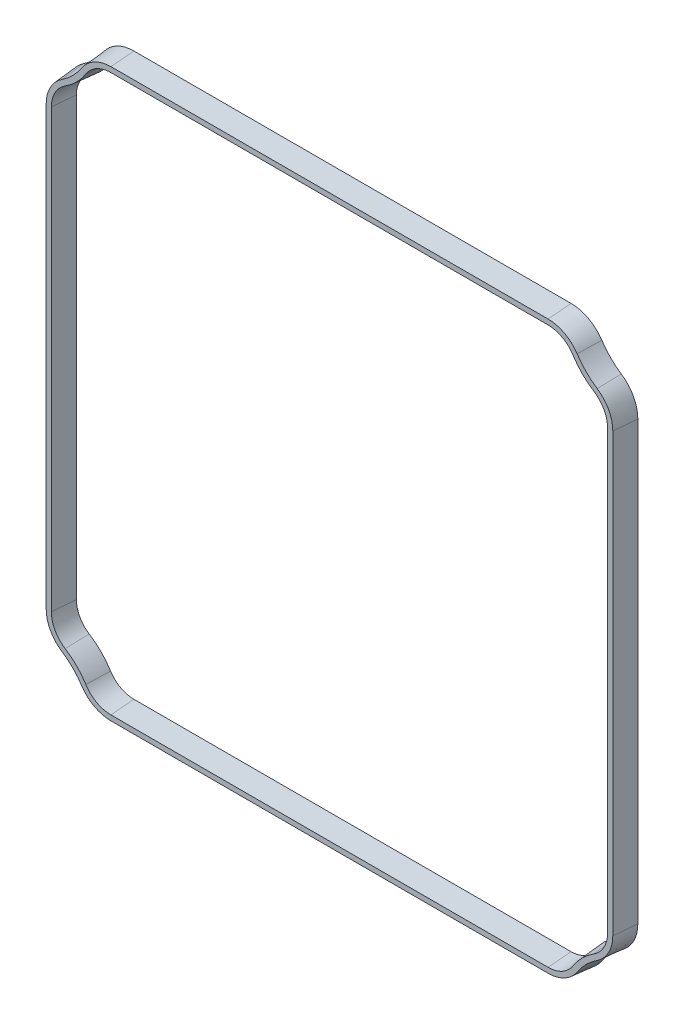
ISO-10303-21;
HEADER;
FILE_DESCRIPTION(('STEP AP214'),'2;1');
FILE_NAME('part.step','',(''),(''),'','','');
FILE_SCHEMA(('AUTOMOTIVE_DESIGN { 1 0 10303 214 1 1 1 1 }'));
ENDSEC;
DATA;
#1=APPLICATION_CONTEXT('core data for automotive mechanical design processes');
#2=APPLICATION_PROTOCOL_DEFINITION('international standard','automotive_design',2000,#1);
#3=PRODUCT_CONTEXT('',#1,'mechanical');
#4=PRODUCT('Part','Part','',(#3));
#5=PRODUCT_RELATED_PRODUCT_CATEGORY('part','',(#4));
#6=PRODUCT_DEFINITION_FORMATION('','',#4);
#7=PRODUCT_DEFINITION_CONTEXT('part definition',#1,'design');
#8=PRODUCT_DEFINITION('design','',#6,#7);
#9=PRODUCT_DEFINITION_SHAPE('','',#8);
#10=(LENGTH_UNIT() NAMED_UNIT(*) SI_UNIT(.MILLI.,.METRE.));
#11=(NAMED_UNIT(*) PLANE_ANGLE_UNIT() SI_UNIT($,.RADIAN.));
#12=(NAMED_UNIT(*) SI_UNIT($,.STERADIAN.) SOLID_ANGLE_UNIT());
#13=UNCERTAINTY_MEASURE_WITH_UNIT(LENGTH_MEASURE(1.E-05),#10,'distance_accuracy_value','');
#14=(GEOMETRIC_REPRESENTATION_CONTEXT(3) GLOBAL_UNCERTAINTY_ASSIGNED_CONTEXT((#13)) GLOBAL_UNIT_ASSIGNED_CONTEXT((#10,
#11,#12)) REPRESENTATION_CONTEXT('',''));
#15=CARTESIAN_POINT('',(0.,0.,0.));
#16=DIRECTION('',(0.,0.,1.));
#17=DIRECTION('',(1.,0.,0.));
#18=AXIS2_PLACEMENT_3D('',#15,#16,#17);
#19=CARTESIAN_POINT('',(58.25,8.00000000000001,2.5));
#20=DIRECTION('',(0.,0.,1.));
#21=DIRECTION('',(1.,0.,0.));
#22=AXIS2_PLACEMENT_3D('',#19,#20,#21);
#23=PLANE('',#22);
#24=CARTESIAN_POINT('',(58.25,8.00000000000001,2.5));
#25=DIRECTION('',(0.,0.,1.));
#26=DIRECTION('',(1.,0.,0.));
#27=AXIS2_PLACEMENT_3D('',#24,#25,#26);
#28=CIRCLE('',#27,3.78127834118519);
#29=CARTESIAN_POINT('',(58.25,4.21872165881481,2.5));
#30=VERTEX_POINT('',#29);
#31=CARTESIAN_POINT('',(61.4041478257971,5.91447431410308,2.5));
#32=VERTEX_POINT('',#31);
#33=EDGE_CURVE('E225',#30,#32,#28,.T.);
#34=ORIENTED_EDGE('',*,*,#33,.T.);
#35=CARTESIAN_POINT('',(67.8427082652416,1.65729173475833,2.5));
#36=DIRECTION('',(0.,0.,1.));
#37=DIRECTION('',(1.,0.,0.));
#38=AXIS2_PLACEMENT_3D('',#35,#36,#37);
#39=CIRCLE('',#38,7.7187216588148);
#40=CARTESIAN_POINT('',(63.5855256858969,8.09585217420291,2.5));
#41=VERTEX_POINT('',#40);
#42=EDGE_CURVE('E244',#32,#41,#39,.F.);
#43=ORIENTED_EDGE('',*,*,#42,.T.);
#44=CARTESIAN_POINT('',(61.5,11.25,2.5));
#45=DIRECTION('',(0.,0.,1.));
#46=DIRECTION('',(1.,0.,0.));
#47=AXIS2_PLACEMENT_3D('',#44,#45,#46);
#48=CIRCLE('',#47,3.78127834118519);
#49=CARTESIAN_POINT('',(65.2812783411852,11.25,2.5));
#50=VERTEX_POINT('',#49);
#51=EDGE_CURVE('E246',#41,#50,#48,.T.);
#52=ORIENTED_EDGE('',*,*,#51,.T.);
#53=DIRECTION('',(0.,-1.,0.));
#54=VECTOR('',#53,1.);
#55=CARTESIAN_POINT('',(65.2812783411852,11.25,2.5));
#56=LINE('',#55,#54);
#57=CARTESIAN_POINT('',(65.2812783411852,58.75,2.5));
#58=VERTEX_POINT('',#57);
#59=EDGE_CURVE('E254',#50,#58,#56,.F.);
#60=ORIENTED_EDGE('',*,*,#59,.T.);
#61=CARTESIAN_POINT('',(61.5,58.75,2.5));
#62=DIRECTION('',(0.,0.,1.));
#63=DIRECTION('',(1.,0.,0.));
#64=AXIS2_PLACEMENT_3D('',#61,#62,#63);
#65=CIRCLE('',#64,3.78127834118519);
#66=CARTESIAN_POINT('',(63.5855256858969,61.9041478257971,2.5));
#67=VERTEX_POINT('',#66);
#68=EDGE_CURVE('E256',#58,#67,#65,.T.);
#69=ORIENTED_EDGE('',*,*,#68,.T.);
#70=CARTESIAN_POINT('',(67.8427082652417,68.3427082652417,2.5));
#71=DIRECTION('',(0.,0.,1.));
#72=DIRECTION('',(1.,0.,0.));
#73=AXIS2_PLACEMENT_3D('',#70,#71,#72);
#74=CIRCLE('',#73,7.71872165881481);
#75=CARTESIAN_POINT('',(61.4041478257971,64.0855256858969,2.5));
#76=VERTEX_POINT('',#75);
#77=EDGE_CURVE('E258',#67,#76,#74,.F.);
#78=ORIENTED_EDGE('',*,*,#77,.T.);
#79=CARTESIAN_POINT('',(58.25,62.,2.5));
#80=DIRECTION('',(0.,0.,1.));
#81=DIRECTION('',(1.,0.,0.));
#82=AXIS2_PLACEMENT_3D('',#79,#80,#81);
#83=CIRCLE('',#82,3.78127834118519);
#84=CARTESIAN_POINT('',(58.25,65.7812783411852,2.5));
#85=VERTEX_POINT('',#84);
#86=EDGE_CURVE('E260',#76,#85,#83,.T.);
#87=ORIENTED_EDGE('',*,*,#86,.T.);
#88=DIRECTION('',(1.,0.,0.));
#89=VECTOR('',#88,1.);
#90=CARTESIAN_POINT('',(58.25,65.7812783411852,2.5));
#91=LINE('',#90,#89);
#92=CARTESIAN_POINT('',(10.75,65.7812783411852,2.5));
#93=VERTEX_POINT('',#92);
#94=EDGE_CURVE('E262',#85,#93,#91,.F.);
#95=ORIENTED_EDGE('',*,*,#94,.T.);
#96=CARTESIAN_POINT('',(10.75,62.,2.5));
#97=DIRECTION('',(0.,0.,1.));
#98=DIRECTION('',(1.,0.,0.));
#99=AXIS2_PLACEMENT_3D('',#96,#97,#98);
#100=CIRCLE('',#99,3.78127834118519);
#101=CARTESIAN_POINT('',(7.59585217420293,64.0855256858969,2.5));
#102=VERTEX_POINT('',#101);
#103=EDGE_CURVE('E264',#93,#102,#100,.T.);
#104=ORIENTED_EDGE('',*,*,#103,.T.);
#105=CARTESIAN_POINT('',(1.15729173475835,68.3427082652416,2.5));
#106=DIRECTION('',(0.,0.,1.));
#107=DIRECTION('',(1.,0.,0.));
#108=AXIS2_PLACEMENT_3D('',#105,#106,#107);
#109=CIRCLE('',#108,7.71872165881481);
#110=CARTESIAN_POINT('',(5.41447431410311,61.9041478257971,2.5));
#111=VERTEX_POINT('',#110);
#112=EDGE_CURVE('E266',#102,#111,#109,.F.);
#113=ORIENTED_EDGE('',*,*,#112,.T.);
#114=CARTESIAN_POINT('',(7.50000000000003,58.75,2.5));
#115=DIRECTION('',(0.,0.,1.));
#116=DIRECTION('',(1.,0.,0.));
#117=AXIS2_PLACEMENT_3D('',#114,#115,#116);
#118=CIRCLE('',#117,3.78127834118519);
#119=CARTESIAN_POINT('',(3.71872165881484,58.75,2.5));
#120=VERTEX_POINT('',#119);
#121=EDGE_CURVE('E268',#111,#120,#118,.T.);
#122=ORIENTED_EDGE('',*,*,#121,.T.);
#123=DIRECTION('',(0.,1.,0.));
#124=VECTOR('',#123,1.);
#125=CARTESIAN_POINT('',(3.71872165881484,58.75,2.5));
#126=LINE('',#125,#124);
#127=CARTESIAN_POINT('',(3.71872165881484,11.25,2.5));
#128=VERTEX_POINT('',#127);
#129=EDGE_CURVE('E270',#120,#128,#126,.F.);
#130=ORIENTED_EDGE('',*,*,#129,.T.);
#131=CARTESIAN_POINT('',(7.5,11.25,2.5));
#132=DIRECTION('',(0.,0.,1.));
#133=DIRECTION('',(1.,0.,0.));
#134=AXIS2_PLACEMENT_3D('',#131,#132,#133);
#135=CIRCLE('',#134,3.78127834118516);
#136=CARTESIAN_POINT('',(5.4144743141031,8.09585217420294,2.5));
#137=VERTEX_POINT('',#136);
#138=EDGE_CURVE('E272',#128,#137,#135,.T.);
#139=ORIENTED_EDGE('',*,*,#138,.T.);
#140=CARTESIAN_POINT('',(1.15729173475836,1.65729173475838,2.5));
#141=DIRECTION('',(0.,0.,1.));
#142=DIRECTION('',(1.,0.,0.));
#143=AXIS2_PLACEMENT_3D('',#140,#141,#142);
#144=CIRCLE('',#143,7.71872165881481);
#145=CARTESIAN_POINT('',(7.59585217420293,5.9144743141031,2.5));
#146=VERTEX_POINT('',#145);
#147=EDGE_CURVE('E274',#137,#146,#144,.F.);
#148=ORIENTED_EDGE('',*,*,#147,.T.);
#149=CARTESIAN_POINT('',(10.75,8.00000000000001,2.5));
#150=DIRECTION('',(0.,0.,1.));
#151=DIRECTION('',(1.,0.,0.));
#152=AXIS2_PLACEMENT_3D('',#149,#150,#151);
#153=CIRCLE('',#152,3.78127834118519);
#154=CARTESIAN_POINT('',(10.75,4.21872165881482,2.5));
#155=VERTEX_POINT('',#154);
#156=EDGE_CURVE('E228',#146,#155,#153,.T.);
#157=ORIENTED_EDGE('',*,*,#156,.T.);
#158=DIRECTION('',(-1.,0.,0.));
#159=VECTOR('',#158,1.);
#160=CARTESIAN_POINT('',(10.75,4.21872165881482,2.5));
#161=LINE('',#160,#159);
#162=EDGE_CURVE('E221',#155,#30,#161,.F.);
#163=ORIENTED_EDGE('',*,*,#162,.T.);
#164=EDGE_LOOP('',(#34,#43,#52,#60,#69,#78,#87,#95,#104,#113,#122,#130,#139,#148,#157,#163));
#165=FACE_BOUND('',#164,.T.);
#166=CARTESIAN_POINT('',(58.25,62.,2.5));
#167=DIRECTION('',(0.,0.,1.));
#168=DIRECTION('',(1.,0.,0.));
#169=AXIS2_PLACEMENT_3D('',#166,#167,#168);
#170=CIRCLE('',#169,3.21872165881482);
#171=CARTESIAN_POINT('',(60.9689339069345,63.7226629173014,2.5));
#172=VERTEX_POINT('',#171);
#173=CARTESIAN_POINT('',(58.25,65.2187216588148,2.5));
#174=VERTEX_POINT('',#173);
#175=EDGE_CURVE('E43',#172,#174,#170,.T.);
#176=ORIENTED_EDGE('',*,*,#175,.F.);
#177=CARTESIAN_POINT('',(67.1196100654211,67.6196100654211,2.5));
#178=DIRECTION('',(0.,0.,1.));
#179=DIRECTION('',(1.,0.,0.));
#180=AXIS2_PLACEMENT_3D('',#177,#178,#179);
#181=CIRCLE('',#180,7.28127834118519);
#182=CARTESIAN_POINT('',(63.2226629173014,61.4689339069345,2.5));
#183=VERTEX_POINT('',#182);
#184=EDGE_CURVE('E115',#183,#172,#181,.F.);
#185=ORIENTED_EDGE('',*,*,#184,.F.);
#186=CARTESIAN_POINT('',(61.5,58.75,2.5));
#187=DIRECTION('',(0.,0.,1.));
#188=DIRECTION('',(1.,0.,0.));
#189=AXIS2_PLACEMENT_3D('',#186,#187,#188);
#190=CIRCLE('',#189,3.21872165881481);
#191=CARTESIAN_POINT('',(64.7187216588149,58.75,2.5));
#192=VERTEX_POINT('',#191);
#193=EDGE_CURVE('E280',#192,#183,#190,.T.);
#194=ORIENTED_EDGE('',*,*,#193,.F.);
#195=DIRECTION('',(0.,1.,0.));
#196=VECTOR('',#195,1.);
#197=CARTESIAN_POINT('',(64.7187216588149,11.25,2.5));
#198=LINE('',#197,#196);
#199=CARTESIAN_POINT('',(64.7187216588149,11.25,2.5));
#200=VERTEX_POINT('',#199);
#201=EDGE_CURVE('E325',#200,#192,#198,.T.);
#202=ORIENTED_EDGE('',*,*,#201,.F.);
#203=CARTESIAN_POINT('',(61.5,11.25,2.5));
#204=DIRECTION('',(0.,0.,1.));
#205=DIRECTION('',(1.,0.,0.));
#206=AXIS2_PLACEMENT_3D('',#203,#204,#205);
#207=CIRCLE('',#206,3.21872165881481);
#208=CARTESIAN_POINT('',(63.2226629173014,8.53106609306546,2.5));
#209=VERTEX_POINT('',#208);
#210=EDGE_CURVE('E327',#209,#200,#207,.T.);
#211=ORIENTED_EDGE('',*,*,#210,.F.);
#212=CARTESIAN_POINT('',(67.1196100654211,2.38038993457892,2.5));
#213=DIRECTION('',(0.,0.,1.));
#214=DIRECTION('',(1.,0.,0.));
#215=AXIS2_PLACEMENT_3D('',#212,#213,#214);
#216=CIRCLE('',#215,7.28127834118519);
#217=CARTESIAN_POINT('',(60.9689339069345,6.27733708269862,2.5));
#218=VERTEX_POINT('',#217);
#219=EDGE_CURVE('E329',#218,#209,#216,.F.);
#220=ORIENTED_EDGE('',*,*,#219,.F.);
#221=CARTESIAN_POINT('',(58.25,8.00000000000001,2.5));
#222=DIRECTION('',(0.,0.,1.));
#223=DIRECTION('',(1.,0.,0.));
#224=AXIS2_PLACEMENT_3D('',#221,#222,#223);
#225=CIRCLE('',#224,3.21872165881481);
#226=CARTESIAN_POINT('',(58.25,4.7812783411852,2.5));
#227=VERTEX_POINT('',#226);
#228=EDGE_CURVE('E331',#227,#218,#225,.T.);
#229=ORIENTED_EDGE('',*,*,#228,.F.);
#230=DIRECTION('',(1.,0.,0.));
#231=VECTOR('',#230,1.);
#232=CARTESIAN_POINT('',(10.75,4.7812783411852,2.5));
#233=LINE('',#232,#231);
#234=CARTESIAN_POINT('',(10.75,4.78127834118519,2.5));
#235=VERTEX_POINT('',#234);
#236=EDGE_CURVE('E333',#235,#227,#233,.T.);
#237=ORIENTED_EDGE('',*,*,#236,.F.);
#238=CARTESIAN_POINT('',(10.75,8.00000000000001,2.5));
#239=DIRECTION('',(0.,0.,1.));
#240=DIRECTION('',(1.,0.,0.));
#241=AXIS2_PLACEMENT_3D('',#238,#239,#240);
#242=CIRCLE('',#241,3.21872165881481);
#243=CARTESIAN_POINT('',(8.03106609306548,6.27733708269864,2.5));
#244=VERTEX_POINT('',#243);
#245=EDGE_CURVE('E335',#244,#235,#242,.T.);
#246=ORIENTED_EDGE('',*,*,#245,.F.);
#247=CARTESIAN_POINT('',(1.88038993457895,2.38038993457897,2.5));
#248=DIRECTION('',(0.,0.,1.));
#249=DIRECTION('',(1.,0.,0.));
#250=AXIS2_PLACEMENT_3D('',#247,#248,#249);
#251=CIRCLE('',#250,7.28127834118519);
#252=CARTESIAN_POINT('',(5.77733708269864,8.53106609306549,2.5));
#253=VERTEX_POINT('',#252);
#254=EDGE_CURVE('E337',#253,#244,#251,.F.);
#255=ORIENTED_EDGE('',*,*,#254,.F.);
#256=CARTESIAN_POINT('',(7.5,11.25,2.5));
#257=DIRECTION('',(0.,0.,1.));
#258=DIRECTION('',(1.,0.,0.));
#259=AXIS2_PLACEMENT_3D('',#256,#257,#258);
#260=CIRCLE('',#259,3.21872165881478);
#261=CARTESIAN_POINT('',(4.28127834118522,11.25,2.5));
#262=VERTEX_POINT('',#261);
#263=EDGE_CURVE('E339',#262,#253,#260,.T.);
#264=ORIENTED_EDGE('',*,*,#263,.F.);
#265=DIRECTION('',(0.,-1.,0.));
#266=VECTOR('',#265,1.);
#267=CARTESIAN_POINT('',(4.28127834118522,58.75,2.5));
#268=LINE('',#267,#266);
#269=CARTESIAN_POINT('',(4.28127834118522,58.75,2.5));
#270=VERTEX_POINT('',#269);
#271=EDGE_CURVE('E341',#270,#262,#268,.T.);
#272=ORIENTED_EDGE('',*,*,#271,.F.);
#273=CARTESIAN_POINT('',(7.50000000000003,58.75,2.5));
#274=DIRECTION('',(0.,0.,1.));
#275=DIRECTION('',(1.,0.,0.));
#276=AXIS2_PLACEMENT_3D('',#273,#274,#275);
#277=CIRCLE('',#276,3.21872165881481);
#278=CARTESIAN_POINT('',(5.77733708269864,61.4689339069345,2.5));
#279=VERTEX_POINT('',#278);
#280=EDGE_CURVE('E343',#279,#270,#277,.T.);
#281=ORIENTED_EDGE('',*,*,#280,.F.);
#282=CARTESIAN_POINT('',(1.88038993457895,67.619610065421,2.5));
#283=DIRECTION('',(0.,0.,1.));
#284=DIRECTION('',(1.,0.,0.));
#285=AXIS2_PLACEMENT_3D('',#282,#283,#284);
#286=CIRCLE('',#285,7.28127834118519);
#287=CARTESIAN_POINT('',(8.03106609306547,63.7226629173014,2.5));
#288=VERTEX_POINT('',#287);
#289=EDGE_CURVE('E345',#288,#279,#286,.F.);
#290=ORIENTED_EDGE('',*,*,#289,.F.);
#291=CARTESIAN_POINT('',(10.75,62.,2.5));
#292=DIRECTION('',(0.,0.,1.));
#293=DIRECTION('',(1.,0.,0.));
#294=AXIS2_PLACEMENT_3D('',#291,#292,#293);
#295=CIRCLE('',#294,3.21872165881481);
#296=CARTESIAN_POINT('',(10.75,65.2187216588148,2.5));
#297=VERTEX_POINT('',#296);
#298=EDGE_CURVE('E347',#297,#288,#295,.T.);
#299=ORIENTED_EDGE('',*,*,#298,.F.);
#300=DIRECTION('',(-1.,0.,0.));
#301=VECTOR('',#300,1.);
#302=CARTESIAN_POINT('',(58.25,65.2187216588148,2.5));
#303=LINE('',#302,#301);
#304=EDGE_CURVE('E348',#174,#297,#303,.T.);
#305=ORIENTED_EDGE('',*,*,#304,.F.);
#306=EDGE_LOOP('',(#176,#185,#194,#202,#211,#220,#229,#237,#246,#255,#264,#272,#281,#290,#299,#305));
#307=FACE_BOUND('',#306,.T.);
#308=ADVANCED_FACE('F39',(#165,#307),#23,.T.);
#309=CARTESIAN_POINT('',(58.25,8.00000000000001,0.));
#310=DIRECTION('',(0.,0.,1.));
#311=DIRECTION('',(1.,0.,0.));
#312=AXIS2_PLACEMENT_3D('',#309,#310,#311);
#313=PLANE('',#312);
#314=CARTESIAN_POINT('',(58.25,8.00000000000001,0.));
#315=DIRECTION('',(0.,0.,1.));
#316=DIRECTION('',(1.,0.,0.));
#317=AXIS2_PLACEMENT_3D('',#314,#315,#316);
#318=CIRCLE('',#317,4.);
#319=CARTESIAN_POINT('',(58.25,4.,0.));
#320=VERTEX_POINT('',#319);
#321=CARTESIAN_POINT('',(61.5865941792145,5.79384060339421,0.));
#322=VERTEX_POINT('',#321);
#323=EDGE_CURVE('E283',#320,#322,#318,.T.);
#324=ORIENTED_EDGE('',*,*,#323,.F.);
#325=DIRECTION('',(1.,0.,0.));
#326=VECTOR('',#325,1.);
#327=CARTESIAN_POINT('',(10.75,4.00000000000001,0.));
#328=LINE('',#327,#326);
#329=CARTESIAN_POINT('',(10.75,4.00000000000001,0.));
#330=VERTEX_POINT('',#329);
#331=EDGE_CURVE('E237',#330,#320,#328,.T.);
#332=ORIENTED_EDGE('',*,*,#331,.F.);
#333=CARTESIAN_POINT('',(10.75,8.00000000000001,0.));
#334=DIRECTION('',(0.,0.,1.));
#335=DIRECTION('',(1.,0.,0.));
#336=AXIS2_PLACEMENT_3D('',#333,#334,#335);
#337=CIRCLE('',#336,4.);
#338=CARTESIAN_POINT('',(7.41340582078552,5.79384060339422,0.));
#339=VERTEX_POINT('',#338);
#340=EDGE_CURVE('E248',#339,#330,#337,.T.);
#341=ORIENTED_EDGE('',*,*,#340,.F.);
#342=CARTESIAN_POINT('',(1.15729173475836,1.65729173475838,0.));
#343=DIRECTION('',(0.,0.,-1.));
#344=DIRECTION('',(1.,0.,0.));
#345=AXIS2_PLACEMENT_3D('',#342,#343,#344);
#346=CIRCLE('',#345,7.5);
#347=CARTESIAN_POINT('',(5.29384060339422,7.91340582078553,0.));
#348=VERTEX_POINT('',#347);
#349=EDGE_CURVE('E446',#348,#339,#346,.T.);
#350=ORIENTED_EDGE('',*,*,#349,.F.);
#351=CARTESIAN_POINT('',(7.5,11.25,0.));
#352=DIRECTION('',(0.,0.,1.));
#353=DIRECTION('',(1.,0.,0.));
#354=AXIS2_PLACEMENT_3D('',#351,#352,#353);
#355=CIRCLE('',#354,3.99999999999997);
#356=CARTESIAN_POINT('',(3.50000000000003,11.25,0.));
#357=VERTEX_POINT('',#356);
#358=EDGE_CURVE('E444',#357,#348,#355,.T.);
#359=ORIENTED_EDGE('',*,*,#358,.F.);
#360=DIRECTION('',(0.,-1.,0.));
#361=VECTOR('',#360,1.);
#362=CARTESIAN_POINT('',(3.50000000000003,58.75,0.));
#363=LINE('',#362,#361);
#364=CARTESIAN_POINT('',(3.50000000000003,58.75,0.));
#365=VERTEX_POINT('',#364);
#366=EDGE_CURVE('E442',#365,#357,#363,.T.);
#367=ORIENTED_EDGE('',*,*,#366,.F.);
#368=CARTESIAN_POINT('',(7.50000000000003,58.75,0.));
#369=DIRECTION('',(0.,0.,1.));
#370=DIRECTION('',(1.,0.,0.));
#371=AXIS2_PLACEMENT_3D('',#368,#369,#370);
#372=CIRCLE('',#371,4.);
#373=CARTESIAN_POINT('',(5.29384060339423,62.0865941792145,0.));
#374=VERTEX_POINT('',#373);
#375=EDGE_CURVE('E440',#374,#365,#372,.T.);
#376=ORIENTED_EDGE('',*,*,#375,.F.);
#377=CARTESIAN_POINT('',(1.15729173475835,68.3427082652416,0.));
#378=DIRECTION('',(0.,0.,-1.));
#379=DIRECTION('',(1.,0.,0.));
#380=AXIS2_PLACEMENT_3D('',#377,#378,#379);
#381=CIRCLE('',#380,7.5);
#382=CARTESIAN_POINT('',(7.41340582078552,64.2061593966058,0.));
#383=VERTEX_POINT('',#382);
#384=EDGE_CURVE('E438',#383,#374,#381,.T.);
#385=ORIENTED_EDGE('',*,*,#384,.F.);
#386=CARTESIAN_POINT('',(10.75,62.,0.));
#387=DIRECTION('',(0.,0.,1.));
#388=DIRECTION('',(1.,0.,0.));
#389=AXIS2_PLACEMENT_3D('',#386,#387,#388);
#390=CIRCLE('',#389,4.);
#391=CARTESIAN_POINT('',(10.75,66.,0.));
#392=VERTEX_POINT('',#391);
#393=EDGE_CURVE('E436',#392,#383,#390,.T.);
#394=ORIENTED_EDGE('',*,*,#393,.F.);
#395=DIRECTION('',(-1.,0.,0.));
#396=VECTOR('',#395,1.);
#397=CARTESIAN_POINT('',(58.25,66.,0.));
#398=LINE('',#397,#396);
#399=CARTESIAN_POINT('',(58.25,66.,0.));
#400=VERTEX_POINT('',#399);
#401=EDGE_CURVE('E434',#400,#392,#398,.T.);
#402=ORIENTED_EDGE('',*,*,#401,.F.);
#403=CARTESIAN_POINT('',(58.25,62.,0.));
#404=DIRECTION('',(0.,0.,1.));
#405=DIRECTION('',(1.,0.,0.));
#406=AXIS2_PLACEMENT_3D('',#403,#404,#405);
#407=CIRCLE('',#406,4.);
#408=CARTESIAN_POINT('',(61.5865941792145,64.2061593966058,0.));
#409=VERTEX_POINT('',#408);
#410=EDGE_CURVE('E432',#409,#400,#407,.T.);
#411=ORIENTED_EDGE('',*,*,#410,.F.);
#412=CARTESIAN_POINT('',(67.8427082652417,68.3427082652417,0.));
#413=DIRECTION('',(0.,0.,-1.));
#414=DIRECTION('',(1.,0.,0.));
#415=AXIS2_PLACEMENT_3D('',#412,#413,#414);
#416=CIRCLE('',#415,7.5);
#417=CARTESIAN_POINT('',(63.7061593966058,62.0865941792145,0.));
#418=VERTEX_POINT('',#417);
#419=EDGE_CURVE('E430',#418,#409,#416,.T.);
#420=ORIENTED_EDGE('',*,*,#419,.F.);
#421=CARTESIAN_POINT('',(61.5,58.75,0.));
#422=DIRECTION('',(0.,0.,1.));
#423=DIRECTION('',(1.,0.,0.));
#424=AXIS2_PLACEMENT_3D('',#421,#422,#423);
#425=CIRCLE('',#424,4.);
#426=CARTESIAN_POINT('',(65.5,58.75,0.));
#427=VERTEX_POINT('',#426);
#428=EDGE_CURVE('E428',#427,#418,#425,.T.);
#429=ORIENTED_EDGE('',*,*,#428,.F.);
#430=DIRECTION('',(0.,1.,0.));
#431=VECTOR('',#430,1.);
#432=CARTESIAN_POINT('',(65.5,11.25,0.));
#433=LINE('',#432,#431);
#434=CARTESIAN_POINT('',(65.5,11.25,0.));
#435=VERTEX_POINT('',#434);
#436=EDGE_CURVE('E426',#435,#427,#433,.T.);
#437=ORIENTED_EDGE('',*,*,#436,.F.);
#438=CARTESIAN_POINT('',(61.5,11.25,0.));
#439=DIRECTION('',(0.,0.,1.));
#440=DIRECTION('',(1.,0.,0.));
#441=AXIS2_PLACEMENT_3D('',#438,#439,#440);
#442=CIRCLE('',#441,4.);
#443=CARTESIAN_POINT('',(63.7061593966058,7.9134058207855,0.));
#444=VERTEX_POINT('',#443);
#445=EDGE_CURVE('E424',#444,#435,#442,.T.);
#446=ORIENTED_EDGE('',*,*,#445,.F.);
#447=CARTESIAN_POINT('',(67.8427082652416,1.65729173475833,0.));
#448=DIRECTION('',(0.,0.,-1.));
#449=DIRECTION('',(1.,0.,0.));
#450=AXIS2_PLACEMENT_3D('',#447,#448,#449);
#451=CIRCLE('',#450,7.49999999999999);
#452=EDGE_CURVE('E422',#322,#444,#451,.T.);
#453=ORIENTED_EDGE('',*,*,#452,.F.);
#454=EDGE_LOOP('',(#324,#332,#341,#350,#359,#367,#376,#385,#394,#402,#411,#420,#429,#437,#446,#453));
#455=FACE_BOUND('',#454,.T.);
#456=CARTESIAN_POINT('',(67.1196100654211,67.6196100654211,0.));
#457=DIRECTION('',(0.,0.,-1.));
#458=DIRECTION('',(1.,0.,0.));
#459=AXIS2_PLACEMENT_3D('',#456,#457,#458);
#460=CIRCLE('',#459,7.5);
#461=CARTESIAN_POINT('',(63.1056028758346,61.284174304406,0.));
#462=VERTEX_POINT('',#461);
#463=CARTESIAN_POINT('',(60.784174304406,63.6056028758346,0.));
#464=VERTEX_POINT('',#463);
#465=EDGE_CURVE('E847',#462,#464,#460,.T.);
#466=ORIENTED_EDGE('',*,*,#465,.T.);
#467=CARTESIAN_POINT('',(58.25,62.,0.));
#468=DIRECTION('',(0.,0.,1.));
#469=DIRECTION('',(1.,0.,0.));
#470=AXIS2_PLACEMENT_3D('',#467,#468,#469);
#471=CIRCLE('',#470,3.);
#472=CARTESIAN_POINT('',(58.25,65.,0.));
#473=VERTEX_POINT('',#472);
#474=EDGE_CURVE('E850',#464,#473,#471,.T.);
#475=ORIENTED_EDGE('',*,*,#474,.T.);
#476=DIRECTION('',(-1.,0.,0.));
#477=VECTOR('',#476,1.);
#478=CARTESIAN_POINT('',(58.25,65.,0.));
#479=LINE('',#478,#477);
#480=CARTESIAN_POINT('',(10.75,65.,0.));
#481=VERTEX_POINT('',#480);
#482=EDGE_CURVE('E390',#473,#481,#479,.T.);
#483=ORIENTED_EDGE('',*,*,#482,.T.);
#484=CARTESIAN_POINT('',(10.75,62.,0.));
#485=DIRECTION('',(0.,0.,1.));
#486=DIRECTION('',(1.,0.,0.));
#487=AXIS2_PLACEMENT_3D('',#484,#485,#486);
#488=CIRCLE('',#487,3.);
#489=CARTESIAN_POINT('',(8.21582569559399,63.6056028758346,0.));
#490=VERTEX_POINT('',#489);
#491=EDGE_CURVE('E361',#481,#490,#488,.T.);
#492=ORIENTED_EDGE('',*,*,#491,.T.);
#493=CARTESIAN_POINT('',(1.88038993457895,67.619610065421,0.));
#494=DIRECTION('',(0.,0.,-1.));
#495=DIRECTION('',(1.,0.,0.));
#496=AXIS2_PLACEMENT_3D('',#493,#494,#495);
#497=CIRCLE('',#496,7.5);
#498=CARTESIAN_POINT('',(5.89439712416543,61.284174304406,0.));
#499=VERTEX_POINT('',#498);
#500=EDGE_CURVE('E385',#490,#499,#497,.T.);
#501=ORIENTED_EDGE('',*,*,#500,.T.);
#502=CARTESIAN_POINT('',(7.50000000000003,58.75,0.));
#503=DIRECTION('',(0.,0.,1.));
#504=DIRECTION('',(1.,0.,0.));
#505=AXIS2_PLACEMENT_3D('',#502,#503,#504);
#506=CIRCLE('',#505,3.);
#507=CARTESIAN_POINT('',(4.50000000000003,58.75,0.));
#508=VERTEX_POINT('',#507);
#509=EDGE_CURVE('E376',#499,#508,#506,.T.);
#510=ORIENTED_EDGE('',*,*,#509,.T.);
#511=DIRECTION('',(0.,-1.,0.));
#512=VECTOR('',#511,1.);
#513=CARTESIAN_POINT('',(4.50000000000003,58.75,0.));
#514=LINE('',#513,#512);
#515=CARTESIAN_POINT('',(4.50000000000003,11.25,0.));
#516=VERTEX_POINT('',#515);
#517=EDGE_CURVE('E384',#508,#516,#514,.T.);
#518=ORIENTED_EDGE('',*,*,#517,.T.);
#519=CARTESIAN_POINT('',(7.5,11.25,0.));
#520=DIRECTION('',(0.,0.,1.));
#521=DIRECTION('',(1.,0.,0.));
#522=AXIS2_PLACEMENT_3D('',#519,#520,#521);
#523=CIRCLE('',#522,2.99999999999997);
#524=CARTESIAN_POINT('',(5.89439712416543,8.71582569559401,0.));
#525=VERTEX_POINT('',#524);
#526=EDGE_CURVE('E395',#516,#525,#523,.T.);
#527=ORIENTED_EDGE('',*,*,#526,.T.);
#528=CARTESIAN_POINT('',(1.88038993457895,2.38038993457897,0.));
#529=DIRECTION('',(0.,0.,-1.));
#530=DIRECTION('',(1.,0.,0.));
#531=AXIS2_PLACEMENT_3D('',#528,#529,#530);
#532=CIRCLE('',#531,7.5);
#533=CARTESIAN_POINT('',(8.215825695594,6.39439712416543,0.));
#534=VERTEX_POINT('',#533);
#535=EDGE_CURVE('E398',#525,#534,#532,.T.);
#536=ORIENTED_EDGE('',*,*,#535,.T.);
#537=CARTESIAN_POINT('',(10.75,8.00000000000001,0.));
#538=DIRECTION('',(0.,0.,1.));
#539=DIRECTION('',(1.,0.,0.));
#540=AXIS2_PLACEMENT_3D('',#537,#538,#539);
#541=CIRCLE('',#540,3.);
#542=CARTESIAN_POINT('',(10.75,5.00000000000001,0.));
#543=VERTEX_POINT('',#542);
#544=EDGE_CURVE('E401',#534,#543,#541,.T.);
#545=ORIENTED_EDGE('',*,*,#544,.T.);
#546=DIRECTION('',(1.,0.,0.));
#547=VECTOR('',#546,1.);
#548=CARTESIAN_POINT('',(10.75,5.00000000000001,0.));
#549=LINE('',#548,#547);
#550=CARTESIAN_POINT('',(58.25,5.00000000000001,0.));
#551=VERTEX_POINT('',#550);
#552=EDGE_CURVE('E404',#543,#551,#549,.T.);
#553=ORIENTED_EDGE('',*,*,#552,.T.);
#554=CARTESIAN_POINT('',(58.25,8.00000000000001,0.));
#555=DIRECTION('',(0.,0.,1.));
#556=DIRECTION('',(1.,0.,0.));
#557=AXIS2_PLACEMENT_3D('',#554,#555,#556);
#558=CIRCLE('',#557,3.);
#559=CARTESIAN_POINT('',(60.784174304406,6.39439712416541,0.));
#560=VERTEX_POINT('',#559);
#561=EDGE_CURVE('E407',#551,#560,#558,.T.);
#562=ORIENTED_EDGE('',*,*,#561,.T.);
#563=CARTESIAN_POINT('',(67.1196100654211,2.38038993457892,0.));
#564=DIRECTION('',(0.,0.,-1.));
#565=DIRECTION('',(1.,0.,0.));
#566=AXIS2_PLACEMENT_3D('',#563,#564,#565);
#567=CIRCLE('',#566,7.5);
#568=CARTESIAN_POINT('',(63.1056028758346,8.71582569559397,0.));
#569=VERTEX_POINT('',#568);
#570=EDGE_CURVE('E410',#560,#569,#567,.T.);
#571=ORIENTED_EDGE('',*,*,#570,.T.);
#572=CARTESIAN_POINT('',(61.5,11.25,0.));
#573=DIRECTION('',(0.,0.,1.));
#574=DIRECTION('',(1.,0.,0.));
#575=AXIS2_PLACEMENT_3D('',#572,#573,#574);
#576=CIRCLE('',#575,3.);
#577=CARTESIAN_POINT('',(64.5,11.25,0.));
#578=VERTEX_POINT('',#577);
#579=EDGE_CURVE('E413',#569,#578,#576,.T.);
#580=ORIENTED_EDGE('',*,*,#579,.T.);
#581=DIRECTION('',(0.,1.,0.));
#582=VECTOR('',#581,1.);
#583=CARTESIAN_POINT('',(64.5,11.25,0.));
#584=LINE('',#583,#582);
#585=CARTESIAN_POINT('',(64.5,58.75,0.));
#586=VERTEX_POINT('',#585);
#587=EDGE_CURVE('E416',#578,#586,#584,.T.);
#588=ORIENTED_EDGE('',*,*,#587,.T.);
#589=CARTESIAN_POINT('',(61.5,58.75,0.));
#590=DIRECTION('',(0.,0.,1.));
#591=DIRECTION('',(1.,0.,0.));
#592=AXIS2_PLACEMENT_3D('',#589,#590,#591);
#593=CIRCLE('',#592,3.);
#594=EDGE_CURVE('E323',#586,#462,#593,.T.);
#595=ORIENTED_EDGE('',*,*,#594,.T.);
#596=EDGE_LOOP('',(#466,#475,#483,#492,#501,#510,#518,#527,#536,#545,#553,#562,#571,#580,#588,#595));
#597=FACE_BOUND('',#596,.T.);
#598=ADVANCED_FACE('F388',(#455,#597),#313,.F.);
#599=CARTESIAN_POINT('',(58.25,8.00000000000001,0.));
#600=DIRECTION('',(0.,0.,-1.));
#601=DIRECTION('',(1.,0.,0.));
#602=AXIS2_PLACEMENT_3D('',#599,#600,#601);
#603=CONICAL_SURFACE('',#602,4.,0.0872664625997167);
#604=ORIENTED_EDGE('',*,*,#323,.T.);
#605=DIRECTION('',(0.0727008359842378,-0.0480698652077261,-0.996194698091745));
#606=VECTOR('',#605,1.);
#607=CARTESIAN_POINT('',(61.5865941792145,5.79384060339421,0.));
#608=LINE('',#607,#606);
#609=EDGE_CURVE('E11',#32,#322,#608,.T.);
#610=ORIENTED_EDGE('',*,*,#609,.F.);
#611=ORIENTED_EDGE('',*,*,#33,.F.);
#612=DIRECTION('',(0.,-0.0871557427476584,-0.996194698091745));
#613=VECTOR('',#612,1.);
#614=CARTESIAN_POINT('',(58.25,4.,0.));
#615=LINE('',#614,#613);
#616=EDGE_CURVE('E232',#30,#320,#615,.T.);
#617=ORIENTED_EDGE('',*,*,#616,.T.);
#618=EDGE_LOOP('',(#604,#610,#611,#617));
#619=FACE_BOUND('',#618,.T.);
#620=ADVANCED_FACE('F243',(#619),#603,.T.);
#621=CARTESIAN_POINT('',(67.8427082652416,1.65729173475833,0.));
#622=DIRECTION('',(0.,0.,1.));
#623=DIRECTION('',(1.,0.,0.));
#624=AXIS2_PLACEMENT_3D('',#621,#622,#623);
#625=CONICAL_SURFACE('',#624,7.49999999999999,0.0872664625997167);
#626=ORIENTED_EDGE('',*,*,#452,.T.);
#627=DIRECTION('',(0.0480698652077255,-0.0727008359842382,-0.996194698091745));
#628=VECTOR('',#627,1.);
#629=CARTESIAN_POINT('',(63.7061593966058,7.9134058207855,0.));
#630=LINE('',#629,#628);
#631=EDGE_CURVE('E49',#41,#444,#630,.T.);
#632=ORIENTED_EDGE('',*,*,#631,.F.);
#633=ORIENTED_EDGE('',*,*,#42,.F.);
#634=ORIENTED_EDGE('',*,*,#609,.T.);
#635=EDGE_LOOP('',(#626,#632,#633,#634));
#636=FACE_BOUND('',#635,.T.);
#637=ADVANCED_FACE('F506',(#636),#625,.F.);
#638=CARTESIAN_POINT('',(61.5,11.25,0.));
#639=DIRECTION('',(0.,0.,-1.));
#640=DIRECTION('',(1.,0.,0.));
#641=AXIS2_PLACEMENT_3D('',#638,#639,#640);
#642=CONICAL_SURFACE('',#641,4.,0.0872664625997167);
#643=ORIENTED_EDGE('',*,*,#445,.T.);
#644=DIRECTION('',(0.0871557427476584,0.,-0.996194698091745));
#645=VECTOR('',#644,1.);
#646=CARTESIAN_POINT('',(65.5,11.25,0.));
#647=LINE('',#646,#645);
#648=EDGE_CURVE('E482',#50,#435,#647,.T.);
#649=ORIENTED_EDGE('',*,*,#648,.F.);
#650=ORIENTED_EDGE('',*,*,#51,.F.);
#651=ORIENTED_EDGE('',*,*,#631,.T.);
#652=EDGE_LOOP('',(#643,#649,#650,#651));
#653=FACE_BOUND('',#652,.T.);
#654=ADVANCED_FACE('F493',(#653),#642,.T.);
#655=CARTESIAN_POINT('',(65.5,11.25,0.));
#656=DIRECTION('',(0.996194698091746,0.,0.0871557427476584));
#657=DIRECTION('',(0.0871557427476584,0.,-0.996194698091746));
#658=AXIS2_PLACEMENT_3D('',#655,#656,#657);
#659=PLANE('',#658);
#660=ORIENTED_EDGE('',*,*,#436,.T.);
#661=DIRECTION('',(0.0871557427476584,0.,-0.996194698091745));
#662=VECTOR('',#661,1.);
#663=CARTESIAN_POINT('',(65.5,58.75,0.));
#664=LINE('',#663,#662);
#665=EDGE_CURVE('E480',#58,#427,#664,.T.);
#666=ORIENTED_EDGE('',*,*,#665,.F.);
#667=ORIENTED_EDGE('',*,*,#59,.F.);
#668=ORIENTED_EDGE('',*,*,#648,.T.);
#669=EDGE_LOOP('',(#660,#666,#667,#668));
#670=FACE_BOUND('',#669,.T.);
#671=ADVANCED_FACE('F499',(#670),#659,.T.);
#672=CARTESIAN_POINT('',(61.5,58.75,0.));
#673=DIRECTION('',(0.,0.,-1.));
#674=DIRECTION('',(1.,0.,0.));
#675=AXIS2_PLACEMENT_3D('',#672,#673,#674);
#676=CONICAL_SURFACE('',#675,4.,0.0872664625997167);
#677=ORIENTED_EDGE('',*,*,#428,.T.);
#678=DIRECTION('',(0.0480698652077256,0.0727008359842381,-0.996194698091745));
#679=VECTOR('',#678,1.);
#680=CARTESIAN_POINT('',(63.7061593966058,62.0865941792145,0.));
#681=LINE('',#680,#679);
#682=EDGE_CURVE('E477',#67,#418,#681,.T.);
#683=ORIENTED_EDGE('',*,*,#682,.F.);
#684=ORIENTED_EDGE('',*,*,#68,.F.);
#685=ORIENTED_EDGE('',*,*,#665,.T.);
#686=EDGE_LOOP('',(#677,#683,#684,#685));
#687=FACE_BOUND('',#686,.T.);
#688=ADVANCED_FACE('F502',(#687),#676,.T.);
#689=CARTESIAN_POINT('',(67.8427082652417,68.3427082652417,0.));
#690=DIRECTION('',(0.,0.,1.));
#691=DIRECTION('',(1.,0.,0.));
#692=AXIS2_PLACEMENT_3D('',#689,#690,#691);
#693=CONICAL_SURFACE('',#692,7.5,0.0872664625997167);
#694=ORIENTED_EDGE('',*,*,#419,.T.);
#695=DIRECTION('',(0.0727008359842378,0.0480698652077261,-0.996194698091745));
#696=VECTOR('',#695,1.);
#697=CARTESIAN_POINT('',(61.5865941792145,64.2061593966058,0.));
#698=LINE('',#697,#696);
#699=EDGE_CURVE('E474',#76,#409,#698,.T.);
#700=ORIENTED_EDGE('',*,*,#699,.F.);
#701=ORIENTED_EDGE('',*,*,#77,.F.);
#702=ORIENTED_EDGE('',*,*,#682,.T.);
#703=EDGE_LOOP('',(#694,#700,#701,#702));
#704=FACE_BOUND('',#703,.T.);
#705=ADVANCED_FACE('F551',(#704),#693,.F.);
#706=CARTESIAN_POINT('',(58.25,62.,0.));
#707=DIRECTION('',(0.,0.,-1.));
#708=DIRECTION('',(1.,0.,0.));
#709=AXIS2_PLACEMENT_3D('',#706,#707,#708);
#710=CONICAL_SURFACE('',#709,4.,0.0872664625997167);
#711=ORIENTED_EDGE('',*,*,#410,.T.);
#712=DIRECTION('',(0.,0.0871557427476584,-0.996194698091745));
#713=VECTOR('',#712,1.);
#714=CARTESIAN_POINT('',(58.25,66.,0.));
#715=LINE('',#714,#713);
#716=EDGE_CURVE('E471',#85,#400,#715,.T.);
#717=ORIENTED_EDGE('',*,*,#716,.F.);
#718=ORIENTED_EDGE('',*,*,#86,.F.);
#719=ORIENTED_EDGE('',*,*,#699,.T.);
#720=EDGE_LOOP('',(#711,#717,#718,#719));
#721=FACE_BOUND('',#720,.T.);
#722=ADVANCED_FACE('F549',(#721),#710,.T.);
#723=CARTESIAN_POINT('',(58.25,66.,0.));
#724=DIRECTION('',(0.,0.996194698091746,0.0871557427476584));
#725=DIRECTION('',(0.,-0.0871557427476584,0.996194698091746));
#726=AXIS2_PLACEMENT_3D('',#723,#724,#725);
#727=PLANE('',#726);
#728=ORIENTED_EDGE('',*,*,#401,.T.);
#729=DIRECTION('',(0.,0.0871557427476584,-0.996194698091745));
#730=VECTOR('',#729,1.);
#731=CARTESIAN_POINT('',(10.75,66.,0.));
#732=LINE('',#731,#730);
#733=EDGE_CURVE('E468',#93,#392,#732,.T.);
#734=ORIENTED_EDGE('',*,*,#733,.F.);
#735=ORIENTED_EDGE('',*,*,#94,.F.);
#736=ORIENTED_EDGE('',*,*,#716,.T.);
#737=EDGE_LOOP('',(#728,#734,#735,#736));
#738=FACE_BOUND('',#737,.T.);
#739=ADVANCED_FACE('F545',(#738),#727,.T.);
#740=CARTESIAN_POINT('',(10.75,62.,0.));
#741=DIRECTION('',(0.,0.,-1.));
#742=DIRECTION('',(1.,0.,0.));
#743=AXIS2_PLACEMENT_3D('',#740,#741,#742);
#744=CONICAL_SURFACE('',#743,4.,0.0872664625997167);
#745=ORIENTED_EDGE('',*,*,#393,.T.);
#746=DIRECTION('',(-0.0727008359842381,0.0480698652077256,-0.996194698091745));
#747=VECTOR('',#746,1.);
#748=CARTESIAN_POINT('',(7.41340582078552,64.2061593966058,0.));
#749=LINE('',#748,#747);
#750=EDGE_CURVE('E465',#102,#383,#749,.T.);
#751=ORIENTED_EDGE('',*,*,#750,.F.);
#752=ORIENTED_EDGE('',*,*,#103,.F.);
#753=ORIENTED_EDGE('',*,*,#733,.T.);
#754=EDGE_LOOP('',(#745,#751,#752,#753));
#755=FACE_BOUND('',#754,.T.);
#756=ADVANCED_FACE('F540',(#755),#744,.T.);
#757=CARTESIAN_POINT('',(1.15729173475835,68.3427082652416,0.));
#758=DIRECTION('',(0.,0.,1.));
#759=DIRECTION('',(1.,0.,0.));
#760=AXIS2_PLACEMENT_3D('',#757,#758,#759);
#761=CONICAL_SURFACE('',#760,7.5,0.0872664625997167);
#762=ORIENTED_EDGE('',*,*,#384,.T.);
#763=DIRECTION('',(-0.0480698652077261,0.0727008359842378,-0.996194698091745));
#764=VECTOR('',#763,1.);
#765=CARTESIAN_POINT('',(5.29384060339423,62.0865941792145,0.));
#766=LINE('',#765,#764);
#767=EDGE_CURVE('E462',#111,#374,#766,.T.);
#768=ORIENTED_EDGE('',*,*,#767,.F.);
#769=ORIENTED_EDGE('',*,*,#112,.F.);
#770=ORIENTED_EDGE('',*,*,#750,.T.);
#771=EDGE_LOOP('',(#762,#768,#769,#770));
#772=FACE_BOUND('',#771,.T.);
#773=ADVANCED_FACE('F534',(#772),#761,.F.);
#774=CARTESIAN_POINT('',(7.50000000000003,58.75,0.));
#775=DIRECTION('',(0.,0.,-1.));
#776=DIRECTION('',(1.,0.,0.));
#777=AXIS2_PLACEMENT_3D('',#774,#775,#776);
#778=CONICAL_SURFACE('',#777,4.,0.0872664625997167);
#779=ORIENTED_EDGE('',*,*,#375,.T.);
#780=DIRECTION('',(-0.0871557427476584,0.,-0.996194698091745));
#781=VECTOR('',#780,1.);
#782=CARTESIAN_POINT('',(3.50000000000003,58.75,0.));
#783=LINE('',#782,#781);
#784=EDGE_CURVE('E459',#120,#365,#783,.T.);
#785=ORIENTED_EDGE('',*,*,#784,.F.);
#786=ORIENTED_EDGE('',*,*,#121,.F.);
#787=ORIENTED_EDGE('',*,*,#767,.T.);
#788=EDGE_LOOP('',(#779,#785,#786,#787));
#789=FACE_BOUND('',#788,.T.);
#790=ADVANCED_FACE('F530',(#789),#778,.T.);
#791=CARTESIAN_POINT('',(3.50000000000003,58.75,0.));
#792=DIRECTION('',(-0.996194698091746,0.,0.0871557427476584));
#793=DIRECTION('',(0.0871557427476584,0.,0.996194698091746));
#794=AXIS2_PLACEMENT_3D('',#791,#792,#793);
#795=PLANE('',#794);
#796=ORIENTED_EDGE('',*,*,#366,.T.);
#797=DIRECTION('',(-0.0871557427476584,0.,-0.996194698091745));
#798=VECTOR('',#797,1.);
#799=CARTESIAN_POINT('',(3.50000000000003,11.25,0.));
#800=LINE('',#799,#798);
#801=EDGE_CURVE('E456',#128,#357,#800,.T.);
#802=ORIENTED_EDGE('',*,*,#801,.F.);
#803=ORIENTED_EDGE('',*,*,#129,.F.);
#804=ORIENTED_EDGE('',*,*,#784,.T.);
#805=EDGE_LOOP('',(#796,#802,#803,#804));
#806=FACE_BOUND('',#805,.T.);
#807=ADVANCED_FACE('F525',(#806),#795,.T.);
#808=CARTESIAN_POINT('',(7.5,11.25,0.));
#809=DIRECTION('',(0.,0.,-1.));
#810=DIRECTION('',(1.,0.,0.));
#811=AXIS2_PLACEMENT_3D('',#808,#809,#810);
#812=CONICAL_SURFACE('',#811,3.99999999999997,0.0872664625997167);
#813=ORIENTED_EDGE('',*,*,#358,.T.);
#814=DIRECTION('',(-0.0480698652077259,-0.0727008359842379,-0.996194698091745));
#815=VECTOR('',#814,1.);
#816=CARTESIAN_POINT('',(5.29384060339422,7.91340582078553,0.));
#817=LINE('',#816,#815);
#818=EDGE_CURVE('E453',#137,#348,#817,.T.);
#819=ORIENTED_EDGE('',*,*,#818,.F.);
#820=ORIENTED_EDGE('',*,*,#138,.F.);
#821=ORIENTED_EDGE('',*,*,#801,.T.);
#822=EDGE_LOOP('',(#813,#819,#820,#821));
#823=FACE_BOUND('',#822,.T.);
#824=ADVANCED_FACE('F519',(#823),#812,.T.);
#825=CARTESIAN_POINT('',(1.15729173475836,1.65729173475838,0.));
#826=DIRECTION('',(0.,0.,1.));
#827=DIRECTION('',(1.,0.,0.));
#828=AXIS2_PLACEMENT_3D('',#825,#826,#827);
#829=CONICAL_SURFACE('',#828,7.5,0.0872664625997167);
#830=ORIENTED_EDGE('',*,*,#349,.T.);
#831=DIRECTION('',(-0.0727008359842381,-0.0480698652077257,-0.996194698091745));
#832=VECTOR('',#831,1.);
#833=CARTESIAN_POINT('',(7.41340582078552,5.79384060339422,0.));
#834=LINE('',#833,#832);
#835=EDGE_CURVE('E450',#146,#339,#834,.T.);
#836=ORIENTED_EDGE('',*,*,#835,.F.);
#837=ORIENTED_EDGE('',*,*,#147,.F.);
#838=ORIENTED_EDGE('',*,*,#818,.T.);
#839=EDGE_LOOP('',(#830,#836,#837,#838));
#840=FACE_BOUND('',#839,.T.);
#841=ADVANCED_FACE('F515',(#840),#829,.F.);
#842=CARTESIAN_POINT('',(10.75,8.00000000000001,0.));
#843=DIRECTION('',(0.,0.,-1.));
#844=DIRECTION('',(1.,0.,0.));
#845=AXIS2_PLACEMENT_3D('',#842,#843,#844);
#846=CONICAL_SURFACE('',#845,4.,0.0872664625997167);
#847=ORIENTED_EDGE('',*,*,#340,.T.);
#848=DIRECTION('',(0.,-0.0871557427476584,-0.996194698091745));
#849=VECTOR('',#848,1.);
#850=CARTESIAN_POINT('',(10.75,4.00000000000001,0.));
#851=LINE('',#850,#849);
#852=EDGE_CURVE('E241',#155,#330,#851,.T.);
#853=ORIENTED_EDGE('',*,*,#852,.F.);
#854=ORIENTED_EDGE('',*,*,#156,.F.);
#855=ORIENTED_EDGE('',*,*,#835,.T.);
#856=EDGE_LOOP('',(#847,#853,#854,#855));
#857=FACE_BOUND('',#856,.T.);
#858=ADVANCED_FACE('F511',(#857),#846,.T.);
#859=CARTESIAN_POINT('',(10.75,4.00000000000001,0.));
#860=DIRECTION('',(0.,-0.996194698091746,0.0871557427476584));
#861=DIRECTION('',(0.,-0.0871557427476584,-0.996194698091746));
#862=AXIS2_PLACEMENT_3D('',#859,#860,#861);
#863=PLANE('',#862);
#864=ORIENTED_EDGE('',*,*,#331,.T.);
#865=ORIENTED_EDGE('',*,*,#616,.F.);
#866=ORIENTED_EDGE('',*,*,#162,.F.);
#867=ORIENTED_EDGE('',*,*,#852,.T.);
#868=EDGE_LOOP('',(#864,#865,#866,#867));
#869=FACE_BOUND('',#868,.T.);
#870=ADVANCED_FACE('F235',(#869),#863,.T.);
#871=CARTESIAN_POINT('',(67.1196100654211,67.6196100654211,0.));
#872=DIRECTION('',(0.,0.,-1.));
#873=DIRECTION('',(1.,0.,0.));
#874=AXIS2_PLACEMENT_3D('',#871,#872,#873);
#875=CONICAL_SURFACE('',#874,7.5,0.0872664625997167);
#876=ORIENTED_EDGE('',*,*,#465,.F.);
#877=DIRECTION('',(-0.0466458370670461,-0.0736226145841792,-0.996194698091745));
#878=VECTOR('',#877,1.);
#879=CARTESIAN_POINT('',(63.1056028758346,61.284174304406,0.));
#880=LINE('',#879,#878);
#881=EDGE_CURVE('E277',#183,#462,#880,.T.);
#882=ORIENTED_EDGE('',*,*,#881,.F.);
#883=ORIENTED_EDGE('',*,*,#184,.T.);
#884=DIRECTION('',(-0.0736226145841788,-0.0466458370670467,-0.996194698091745));
#885=VECTOR('',#884,1.);
#886=CARTESIAN_POINT('',(60.784174304406,63.6056028758346,0.));
#887=LINE('',#886,#885);
#888=EDGE_CURVE('E281',#172,#464,#887,.T.);
#889=ORIENTED_EDGE('',*,*,#888,.T.);
#890=EDGE_LOOP('',(#876,#882,#883,#889));
#891=FACE_BOUND('',#890,.T.);
#892=ADVANCED_FACE('F571',(#891),#875,.T.);
#893=CARTESIAN_POINT('',(58.25,62.,0.));
#894=DIRECTION('',(0.,0.,1.));
#895=DIRECTION('',(1.,0.,0.));
#896=AXIS2_PLACEMENT_3D('',#893,#894,#895);
#897=CONICAL_SURFACE('',#896,3.,0.0872664625997167);
#898=ORIENTED_EDGE('',*,*,#474,.F.);
#899=ORIENTED_EDGE('',*,*,#888,.F.);
#900=ORIENTED_EDGE('',*,*,#175,.T.);
#901=DIRECTION('',(0.,-0.0871557427476584,-0.996194698091745));
#902=VECTOR('',#901,1.);
#903=CARTESIAN_POINT('',(58.25,65.,0.));
#904=LINE('',#903,#902);
#905=EDGE_CURVE('E284',#174,#473,#904,.T.);
#906=ORIENTED_EDGE('',*,*,#905,.T.);
#907=EDGE_LOOP('',(#898,#899,#900,#906));
#908=FACE_BOUND('',#907,.T.);
#909=ADVANCED_FACE('F638',(#908),#897,.F.);
#910=CARTESIAN_POINT('',(58.25,65.,0.));
#911=DIRECTION('',(0.,-0.996194698091746,0.0871557427476584));
#912=DIRECTION('',(0.,-0.0871557427476584,-0.996194698091746));
#913=AXIS2_PLACEMENT_3D('',#910,#911,#912);
#914=PLANE('',#913);
#915=ORIENTED_EDGE('',*,*,#482,.F.);
#916=ORIENTED_EDGE('',*,*,#905,.F.);
#917=ORIENTED_EDGE('',*,*,#304,.T.);
#918=DIRECTION('',(0.,-0.0871557427476584,-0.996194698091745));
#919=VECTOR('',#918,1.);
#920=CARTESIAN_POINT('',(10.75,65.,0.));
#921=LINE('',#920,#919);
#922=EDGE_CURVE('E286',#297,#481,#921,.T.);
#923=ORIENTED_EDGE('',*,*,#922,.T.);
#924=EDGE_LOOP('',(#915,#916,#917,#923));
#925=FACE_BOUND('',#924,.T.);
#926=ADVANCED_FACE('F353',(#925),#914,.T.);
#927=CARTESIAN_POINT('',(10.75,62.,0.));
#928=DIRECTION('',(0.,0.,1.));
#929=DIRECTION('',(1.,0.,0.));
#930=AXIS2_PLACEMENT_3D('',#927,#928,#929);
#931=CONICAL_SURFACE('',#930,3.,0.0872664625997167);
#932=ORIENTED_EDGE('',*,*,#491,.F.);
#933=ORIENTED_EDGE('',*,*,#922,.F.);
#934=ORIENTED_EDGE('',*,*,#298,.T.);
#935=DIRECTION('',(0.073622614584179,-0.0466458370670464,-0.996194698091745));
#936=VECTOR('',#935,1.);
#937=CARTESIAN_POINT('',(8.21582569559399,63.6056028758346,0.));
#938=LINE('',#937,#936);
#939=EDGE_CURVE('E289',#288,#490,#938,.T.);
#940=ORIENTED_EDGE('',*,*,#939,.T.);
#941=EDGE_LOOP('',(#932,#933,#934,#940));
#942=FACE_BOUND('',#941,.T.);
#943=ADVANCED_FACE('F358',(#942),#931,.F.);
#944=CARTESIAN_POINT('',(1.88038993457895,67.619610065421,0.));
#945=DIRECTION('',(0.,0.,-1.));
#946=DIRECTION('',(1.,0.,0.));
#947=AXIS2_PLACEMENT_3D('',#944,#945,#946);
#948=CONICAL_SURFACE('',#947,7.5,0.0872664625997167);
#949=ORIENTED_EDGE('',*,*,#500,.F.);
#950=ORIENTED_EDGE('',*,*,#939,.F.);
#951=ORIENTED_EDGE('',*,*,#289,.T.);
#952=DIRECTION('',(0.0466458370670468,-0.0736226145841787,-0.996194698091745));
#953=VECTOR('',#952,1.);
#954=CARTESIAN_POINT('',(5.89439712416543,61.284174304406,0.));
#955=LINE('',#954,#953);
#956=EDGE_CURVE('E292',#279,#499,#955,.T.);
#957=ORIENTED_EDGE('',*,*,#956,.T.);
#958=EDGE_LOOP('',(#949,#950,#951,#957));
#959=FACE_BOUND('',#958,.T.);
#960=ADVANCED_FACE('F369',(#959),#948,.T.);
#961=CARTESIAN_POINT('',(7.50000000000003,58.75,0.));
#962=DIRECTION('',(0.,0.,1.));
#963=DIRECTION('',(1.,0.,0.));
#964=AXIS2_PLACEMENT_3D('',#961,#962,#963);
#965=CONICAL_SURFACE('',#964,3.,0.0872664625997167);
#966=ORIENTED_EDGE('',*,*,#509,.F.);
#967=ORIENTED_EDGE('',*,*,#956,.F.);
#968=ORIENTED_EDGE('',*,*,#280,.T.);
#969=DIRECTION('',(0.0871557427476584,0.,-0.996194698091745));
#970=VECTOR('',#969,1.);
#971=CARTESIAN_POINT('',(4.50000000000003,58.75,0.));
#972=LINE('',#971,#970);
#973=EDGE_CURVE('E295',#270,#508,#972,.T.);
#974=ORIENTED_EDGE('',*,*,#973,.T.);
#975=EDGE_LOOP('',(#966,#967,#968,#974));
#976=FACE_BOUND('',#975,.T.);
#977=ADVANCED_FACE('F373',(#976),#965,.F.);
#978=CARTESIAN_POINT('',(4.50000000000003,58.75,0.));
#979=DIRECTION('',(0.996194698091746,0.,0.0871557427476584));
#980=DIRECTION('',(0.0871557427476584,0.,-0.996194698091746));
#981=AXIS2_PLACEMENT_3D('',#978,#979,#980);
#982=PLANE('',#981);
#983=ORIENTED_EDGE('',*,*,#517,.F.);
#984=ORIENTED_EDGE('',*,*,#973,.F.);
#985=ORIENTED_EDGE('',*,*,#271,.T.);
#986=DIRECTION('',(0.0871557427476584,0.,-0.996194698091745));
#987=VECTOR('',#986,1.);
#988=CARTESIAN_POINT('',(4.50000000000003,11.25,0.));
#989=LINE('',#988,#987);
#990=EDGE_CURVE('E298',#262,#516,#989,.T.);
#991=ORIENTED_EDGE('',*,*,#990,.T.);
#992=EDGE_LOOP('',(#983,#984,#985,#991));
#993=FACE_BOUND('',#992,.T.);
#994=ADVANCED_FACE('F674',(#993),#982,.T.);
#995=CARTESIAN_POINT('',(7.5,11.25,0.));
#996=DIRECTION('',(0.,0.,1.));
#997=DIRECTION('',(1.,0.,0.));
#998=AXIS2_PLACEMENT_3D('',#995,#996,#997);
#999=CONICAL_SURFACE('',#998,2.99999999999997,0.0872664625997167);
#1000=ORIENTED_EDGE('',*,*,#526,.F.);
#1001=ORIENTED_EDGE('',*,*,#990,.F.);
#1002=ORIENTED_EDGE('',*,*,#263,.T.);
#1003=DIRECTION('',(0.0466458370670466,0.0736226145841788,-0.996194698091745));
#1004=VECTOR('',#1003,1.);
#1005=CARTESIAN_POINT('',(5.89439712416543,8.71582569559401,0.));
#1006=LINE('',#1005,#1004);
#1007=EDGE_CURVE('E301',#253,#525,#1006,.T.);
#1008=ORIENTED_EDGE('',*,*,#1007,.T.);
#1009=EDGE_LOOP('',(#1000,#1001,#1002,#1008));
#1010=FACE_BOUND('',#1009,.T.);
#1011=ADVANCED_FACE('F682',(#1010),#999,.F.);
#1012=CARTESIAN_POINT('',(1.88038993457895,2.38038993457897,0.));
#1013=DIRECTION('',(0.,0.,-1.));
#1014=DIRECTION('',(1.,0.,0.));
#1015=AXIS2_PLACEMENT_3D('',#1012,#1013,#1014);
#1016=CONICAL_SURFACE('',#1015,7.5,0.0872664625997167);
#1017=ORIENTED_EDGE('',*,*,#535,.F.);
#1018=ORIENTED_EDGE('',*,*,#1007,.F.);
#1019=ORIENTED_EDGE('',*,*,#254,.T.);
#1020=DIRECTION('',(0.0736226145841789,0.0466458370670465,-0.996194698091745));
#1021=VECTOR('',#1020,1.);
#1022=CARTESIAN_POINT('',(8.21582569559399,6.39439712416543,0.));
#1023=LINE('',#1022,#1021);
#1024=EDGE_CURVE('E304',#244,#534,#1023,.T.);
#1025=ORIENTED_EDGE('',*,*,#1024,.T.);
#1026=EDGE_LOOP('',(#1017,#1018,#1019,#1025));
#1027=FACE_BOUND('',#1026,.T.);
#1028=ADVANCED_FACE('F691',(#1027),#1016,.T.);
#1029=CARTESIAN_POINT('',(10.75,8.00000000000001,0.));
#1030=DIRECTION('',(0.,0.,1.));
#1031=DIRECTION('',(1.,0.,0.));
#1032=AXIS2_PLACEMENT_3D('',#1029,#1030,#1031);
#1033=CONICAL_SURFACE('',#1032,3.,0.0872664625997167);
#1034=ORIENTED_EDGE('',*,*,#544,.F.);
#1035=ORIENTED_EDGE('',*,*,#1024,.F.);
#1036=ORIENTED_EDGE('',*,*,#245,.T.);
#1037=DIRECTION('',(0.,0.0871557427476584,-0.996194698091745));
#1038=VECTOR('',#1037,1.);
#1039=CARTESIAN_POINT('',(10.75,5.00000000000001,0.));
#1040=LINE('',#1039,#1038);
#1041=EDGE_CURVE('E307',#235,#543,#1040,.T.);
#1042=ORIENTED_EDGE('',*,*,#1041,.T.);
#1043=EDGE_LOOP('',(#1034,#1035,#1036,#1042));
#1044=FACE_BOUND('',#1043,.T.);
#1045=ADVANCED_FACE('F700',(#1044),#1033,.F.);
#1046=CARTESIAN_POINT('',(10.75,5.00000000000001,0.));
#1047=DIRECTION('',(0.,0.996194698091746,0.0871557427476584));
#1048=DIRECTION('',(0.,-0.0871557427476584,0.996194698091746));
#1049=AXIS2_PLACEMENT_3D('',#1046,#1047,#1048);
#1050=PLANE('',#1049);
#1051=ORIENTED_EDGE('',*,*,#552,.F.);
#1052=ORIENTED_EDGE('',*,*,#1041,.F.);
#1053=ORIENTED_EDGE('',*,*,#236,.T.);
#1054=DIRECTION('',(0.,0.0871557427476584,-0.996194698091745));
#1055=VECTOR('',#1054,1.);
#1056=CARTESIAN_POINT('',(58.25,5.00000000000001,0.));
#1057=LINE('',#1056,#1055);
#1058=EDGE_CURVE('E310',#227,#551,#1057,.T.);
#1059=ORIENTED_EDGE('',*,*,#1058,.T.);
#1060=EDGE_LOOP('',(#1051,#1052,#1053,#1059));
#1061=FACE_BOUND('',#1060,.T.);
#1062=ADVANCED_FACE('F709',(#1061),#1050,.T.);
#1063=CARTESIAN_POINT('',(58.25,8.00000000000001,0.));
#1064=DIRECTION('',(0.,0.,1.));
#1065=DIRECTION('',(1.,0.,0.));
#1066=AXIS2_PLACEMENT_3D('',#1063,#1064,#1065);
#1067=CONICAL_SURFACE('',#1066,3.,0.0872664625997167);
#1068=ORIENTED_EDGE('',*,*,#561,.F.);
#1069=ORIENTED_EDGE('',*,*,#1058,.F.);
#1070=ORIENTED_EDGE('',*,*,#228,.T.);
#1071=DIRECTION('',(-0.0736226145841787,0.0466458370670469,-0.996194698091745));
#1072=VECTOR('',#1071,1.);
#1073=CARTESIAN_POINT('',(60.784174304406,6.39439712416541,0.));
#1074=LINE('',#1073,#1072);
#1075=EDGE_CURVE('E313',#218,#560,#1074,.T.);
#1076=ORIENTED_EDGE('',*,*,#1075,.T.);
#1077=EDGE_LOOP('',(#1068,#1069,#1070,#1076));
#1078=FACE_BOUND('',#1077,.T.);
#1079=ADVANCED_FACE('F718',(#1078),#1067,.F.);
#1080=CARTESIAN_POINT('',(67.1196100654211,2.38038993457892,0.));
#1081=DIRECTION('',(0.,0.,-1.));
#1082=DIRECTION('',(1.,0.,0.));
#1083=AXIS2_PLACEMENT_3D('',#1080,#1081,#1082);
#1084=CONICAL_SURFACE('',#1083,7.5,0.0872664625997167);
#1085=ORIENTED_EDGE('',*,*,#570,.F.);
#1086=ORIENTED_EDGE('',*,*,#1075,.F.);
#1087=ORIENTED_EDGE('',*,*,#219,.T.);
#1088=DIRECTION('',(-0.0466458370670463,0.0736226145841791,-0.996194698091745));
#1089=VECTOR('',#1088,1.);
#1090=CARTESIAN_POINT('',(63.1056028758346,8.71582569559397,0.));
#1091=LINE('',#1090,#1089);
#1092=EDGE_CURVE('E316',#209,#569,#1091,.T.);
#1093=ORIENTED_EDGE('',*,*,#1092,.T.);
#1094=EDGE_LOOP('',(#1085,#1086,#1087,#1093));
#1095=FACE_BOUND('',#1094,.T.);
#1096=ADVANCED_FACE('F727',(#1095),#1084,.T.);
#1097=CARTESIAN_POINT('',(61.5,11.25,0.));
#1098=DIRECTION('',(0.,0.,1.));
#1099=DIRECTION('',(1.,0.,0.));
#1100=AXIS2_PLACEMENT_3D('',#1097,#1098,#1099);
#1101=CONICAL_SURFACE('',#1100,3.,0.0872664625997167);
#1102=ORIENTED_EDGE('',*,*,#579,.F.);
#1103=ORIENTED_EDGE('',*,*,#1092,.F.);
#1104=ORIENTED_EDGE('',*,*,#210,.T.);
#1105=DIRECTION('',(-0.0871557427476584,0.,-0.996194698091745));
#1106=VECTOR('',#1105,1.);
#1107=CARTESIAN_POINT('',(64.5,11.25,0.));
#1108=LINE('',#1107,#1106);
#1109=EDGE_CURVE('E319',#200,#578,#1108,.T.);
#1110=ORIENTED_EDGE('',*,*,#1109,.T.);
#1111=EDGE_LOOP('',(#1102,#1103,#1104,#1110));
#1112=FACE_BOUND('',#1111,.T.);
#1113=ADVANCED_FACE('F736',(#1112),#1101,.F.);
#1114=CARTESIAN_POINT('',(64.5,11.25,0.));
#1115=DIRECTION('',(-0.996194698091746,0.,0.0871557427476584));
#1116=DIRECTION('',(0.0871557427476584,0.,0.996194698091746));
#1117=AXIS2_PLACEMENT_3D('',#1114,#1115,#1116);
#1118=PLANE('',#1117);
#1119=ORIENTED_EDGE('',*,*,#587,.F.);
#1120=ORIENTED_EDGE('',*,*,#1109,.F.);
#1121=ORIENTED_EDGE('',*,*,#201,.T.);
#1122=DIRECTION('',(-0.0871557427476584,0.,-0.996194698091745));
#1123=VECTOR('',#1122,1.);
#1124=CARTESIAN_POINT('',(64.5,58.75,0.));
#1125=LINE('',#1124,#1123);
#1126=EDGE_CURVE('E58',#192,#586,#1125,.T.);
#1127=ORIENTED_EDGE('',*,*,#1126,.T.);
#1128=EDGE_LOOP('',(#1119,#1120,#1121,#1127));
#1129=FACE_BOUND('',#1128,.T.);
#1130=ADVANCED_FACE('F745',(#1129),#1118,.T.);
#1131=CARTESIAN_POINT('',(61.5,58.75,0.));
#1132=DIRECTION('',(0.,0.,1.));
#1133=DIRECTION('',(1.,0.,0.));
#1134=AXIS2_PLACEMENT_3D('',#1131,#1132,#1133);
#1135=CONICAL_SURFACE('',#1134,3.,0.0872664625997167);
#1136=ORIENTED_EDGE('',*,*,#594,.F.);
#1137=ORIENTED_EDGE('',*,*,#1126,.F.);
#1138=ORIENTED_EDGE('',*,*,#193,.T.);
#1139=ORIENTED_EDGE('',*,*,#881,.T.);
#1140=EDGE_LOOP('',(#1136,#1137,#1138,#1139));
#1141=FACE_BOUND('',#1140,.T.);
#1142=ADVANCED_FACE('F41',(#1141),#1135,.F.);
#1143=CLOSED_SHELL('',(#308,#598,#620,#637,#654,#671,#688,#705,#722,#739,#756,#773,#790,#807,
#824,#841,#858,#870,#892,#909,#926,#943,#960,#977,#994,#1011,#1028,#1045,#1062,#1079,#1096,
#1113,#1130,#1142));
#1144=MANIFOLD_SOLID_BREP('B2',#1143);
#1145=ADVANCED_BREP_SHAPE_REPRESENTATION('',(#18,#1144),#14);
#1146=SHAPE_DEFINITION_REPRESENTATION(#9,#1145);
ENDSEC;
END-ISO-10303-21;
